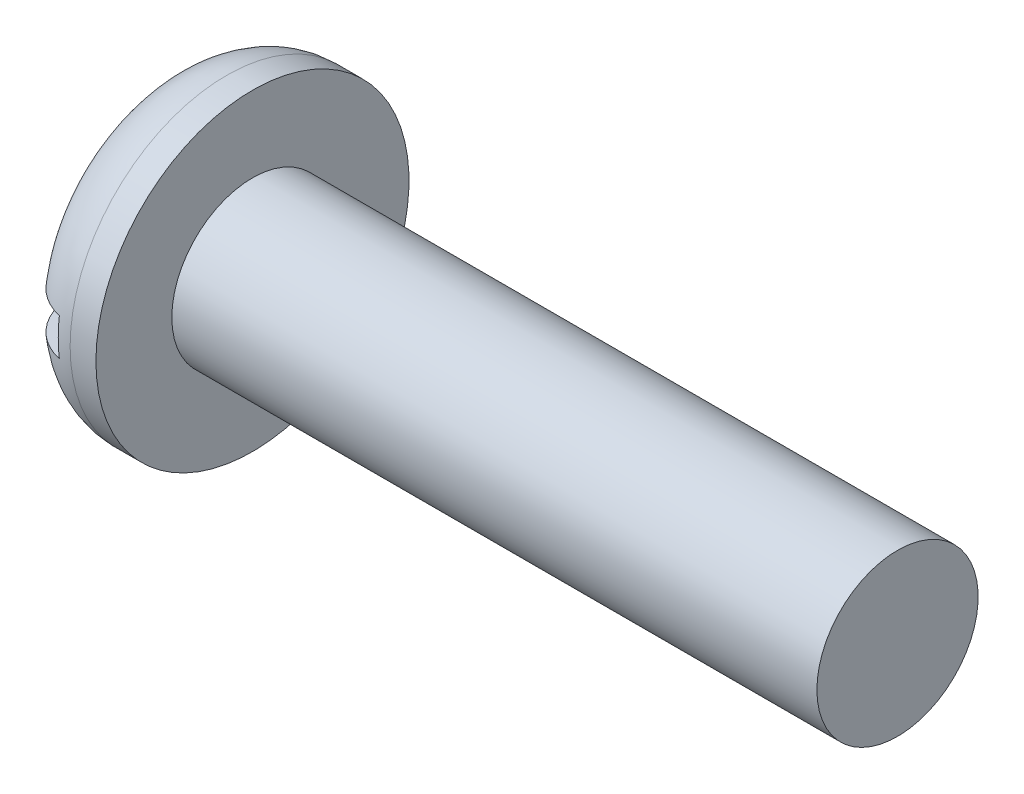
ISO-10303-21;
HEADER;
FILE_DESCRIPTION(('STEP AP214'),'2;1');
FILE_NAME('part.step','',(''),(''),'','','');
FILE_SCHEMA(('AUTOMOTIVE_DESIGN { 1 0 10303 214 1 1 1 1 }'));
ENDSEC;
DATA;
#1=APPLICATION_CONTEXT('core data for automotive mechanical design processes');
#2=APPLICATION_PROTOCOL_DEFINITION('international standard','automotive_design',2000,#1);
#3=PRODUCT_CONTEXT('',#1,'mechanical');
#4=PRODUCT('Part','Part','',(#3));
#5=PRODUCT_RELATED_PRODUCT_CATEGORY('part','',(#4));
#6=PRODUCT_DEFINITION_FORMATION('','',#4);
#7=PRODUCT_DEFINITION_CONTEXT('part definition',#1,'design');
#8=PRODUCT_DEFINITION('design','',#6,#7);
#9=PRODUCT_DEFINITION_SHAPE('','',#8);
#10=(LENGTH_UNIT() NAMED_UNIT(*) SI_UNIT(.MILLI.,.METRE.));
#11=(NAMED_UNIT(*) PLANE_ANGLE_UNIT() SI_UNIT($,.RADIAN.));
#12=(NAMED_UNIT(*) SI_UNIT($,.STERADIAN.) SOLID_ANGLE_UNIT());
#13=UNCERTAINTY_MEASURE_WITH_UNIT(LENGTH_MEASURE(1.E-05),#10,'distance_accuracy_value','');
#14=(GEOMETRIC_REPRESENTATION_CONTEXT(3) GLOBAL_UNCERTAINTY_ASSIGNED_CONTEXT((#13)) GLOBAL_UNIT_ASSIGNED_CONTEXT((#10,
#11,#12)) REPRESENTATION_CONTEXT('',''));
#15=CARTESIAN_POINT('',(0.,0.,0.));
#16=DIRECTION('',(0.,0.,1.));
#17=DIRECTION('',(1.,0.,0.));
#18=AXIS2_PLACEMENT_3D('',#15,#16,#17);
#19=CARTESIAN_POINT('',(0.,0.,0.));
#20=DIRECTION('',(-1.,0.,0.));
#21=DIRECTION('',(0.,0.,1.));
#22=AXIS2_PLACEMENT_3D('',#19,#20,#21);
#23=PLANE('',#22);
#24=DIRECTION('',(0.,0.,-1.));
#25=VECTOR('',#24,1.);
#26=CARTESIAN_POINT('',(0.,1.1049,9.2456));
#27=LINE('',#26,#25);
#28=CARTESIAN_POINT('',(0.,1.1049,5.50358569934184));
#29=VERTEX_POINT('',#28);
#30=CARTESIAN_POINT('',(0.,1.1049,-5.50358569934184));
#31=VERTEX_POINT('',#30);
#32=EDGE_CURVE('E85',#29,#31,#27,.T.);
#33=ORIENTED_EDGE('',*,*,#32,.F.);
#34=CARTESIAN_POINT('',(0.,0.,0.));
#35=DIRECTION('',(-1.,0.,0.));
#36=DIRECTION('',(0.,0.,1.));
#37=AXIS2_PLACEMENT_3D('',#34,#35,#36);
#38=CIRCLE('',#37,5.61339999999997);
#39=EDGE_CURVE('E92',#29,#31,#38,.T.);
#40=ORIENTED_EDGE('',*,*,#39,.T.);
#41=EDGE_LOOP('',(#33,#40));
#42=FACE_BOUND('',#41,.T.);
#43=ADVANCED_FACE('F32',(#42),#23,.T.);
#44=CARTESIAN_POINT('',(-25.4,0.,0.));
#45=DIRECTION('',(-1.,0.,0.));
#46=DIRECTION('',(0.,0.,1.));
#47=AXIS2_PLACEMENT_3D('',#44,#45,#46);
#48=CYLINDRICAL_SURFACE('',#47,4.7625);
#49=CARTESIAN_POINT('',(43.2562,0.,0.));
#50=DIRECTION('',(-1.,0.,0.));
#51=DIRECTION('',(0.,0.,1.));
#52=AXIS2_PLACEMENT_3D('',#49,#50,#51);
#53=CIRCLE('',#52,4.7625);
#54=CARTESIAN_POINT('',(43.2562,0.,4.7625));
#55=VERTEX_POINT('',#54);
#56=EDGE_CURVE('E96',#55,#55,#53,.T.);
#57=ORIENTED_EDGE('',*,*,#56,.T.);
#58=EDGE_LOOP('',(#57));
#59=FACE_BOUND('',#58,.T.);
#60=CARTESIAN_POINT('',(5.1562,0.,0.));
#61=DIRECTION('',(-1.,0.,0.));
#62=DIRECTION('',(0.,0.,1.));
#63=AXIS2_PLACEMENT_3D('',#60,#61,#62);
#64=CIRCLE('',#63,4.7625);
#65=CARTESIAN_POINT('',(5.1562,0.,4.7625));
#66=VERTEX_POINT('',#65);
#67=EDGE_CURVE('E159',#66,#66,#64,.T.);
#68=ORIENTED_EDGE('',*,*,#67,.F.);
#69=EDGE_LOOP('',(#68));
#70=FACE_BOUND('',#69,.T.);
#71=ADVANCED_FACE('F34',(#59,#70),#48,.T.);
#72=CARTESIAN_POINT('',(43.2562,4.7625,0.));
#73=DIRECTION('',(1.,0.,0.));
#74=DIRECTION('',(0.,0.,-1.));
#75=AXIS2_PLACEMENT_3D('',#72,#73,#74);
#76=PLANE('',#75);
#77=ORIENTED_EDGE('',*,*,#56,.F.);
#78=EDGE_LOOP('',(#77));
#79=FACE_BOUND('',#78,.T.);
#80=ADVANCED_FACE('F145',(#79),#76,.T.);
#81=DIRECTION('',(0.,0.,1.));
#82=VECTOR('',#81,1.);
#83=CARTESIAN_POINT('',(0.,-1.1049,-9.2456));
#84=LINE('',#83,#82);
#85=CARTESIAN_POINT('',(0.,-1.1049,-5.50358569934184));
#86=VERTEX_POINT('',#85);
#87=CARTESIAN_POINT('',(0.,-1.1049,5.50358569934184));
#88=VERTEX_POINT('',#87);
#89=EDGE_CURVE('E76',#86,#88,#84,.T.);
#90=ORIENTED_EDGE('',*,*,#89,.F.);
#91=EDGE_CURVE('E83',#86,#88,#38,.T.);
#92=ORIENTED_EDGE('',*,*,#91,.T.);
#93=EDGE_LOOP('',(#90,#92));
#94=FACE_BOUND('',#93,.T.);
#95=ADVANCED_FACE('F82',(#94),#23,.T.);
#96=CARTESIAN_POINT('',(3.6322,0.,0.));
#97=DIRECTION('',(-1.,0.,0.));
#98=DIRECTION('',(0.,0.,1.));
#99=AXIS2_PLACEMENT_3D('',#96,#97,#98);
#100=TOROIDAL_SURFACE('',#99,5.6134,3.6322);
#101=CARTESIAN_POINT('',(1.63607552620524,1.1049,-8.57705458466052));
#102=CARTESIAN_POINT('',(1.80526582947215,1.1049,-8.68926175520025));
#103=CARTESIAN_POINT('',(1.98396739841599,1.1049,-8.78725504147634));
#104=CARTESIAN_POINT('',(2.3553557194657,1.1049,-8.95190398428891));
#105=CARTESIAN_POINT('',(2.54805035400558,1.1049,-9.0185418174154));
#106=CARTESIAN_POINT('',(2.94188428774246,1.1049,-9.11847781019814));
#107=CARTESIAN_POINT('',(3.14302251764104,1.1049,-9.15178017827184));
#108=CARTESIAN_POINT('',(3.54801035915273,1.1049,-9.18407676460486));
#109=CARTESIAN_POINT('',(3.75185965697099,1.1049,-9.18307491947623));
#110=CARTESIAN_POINT('',(4.15616800672068,1.1049,-9.14683312767999));
#111=CARTESIAN_POINT('',(4.3566318717212,1.1049,-9.11164684831084));
#112=CARTESIAN_POINT('',(4.74881439313731,1.1049,-9.00813904376177));
#113=CARTESIAN_POINT('',(4.94053295079168,1.1049,-8.93981714448078));
#114=CARTESIAN_POINT('',(5.30993606050095,1.1049,-8.77196616021689));
#115=CARTESIAN_POINT('',(5.4876111114311,1.1049,-8.67241617035549));
#116=CARTESIAN_POINT('',(5.82380755419607,1.1049,-8.44500778717915));
#117=CARTESIAN_POINT('',(5.9823287471921,1.1049,-8.3171491000268));
#118=CARTESIAN_POINT('',(6.27640711545309,1.1049,-8.0362598290991));
#119=CARTESIAN_POINT('',(6.41187319166582,1.1049,-7.88313389082095));
#120=CARTESIAN_POINT('',(6.6554063345752,1.1049,-7.55646535150447));
#121=CARTESIAN_POINT('',(6.76347271484454,1.1049,-7.38292223912696));
#122=CARTESIAN_POINT('',(6.95010924023208,1.1049,-7.01891475284266));
#123=CARTESIAN_POINT('',(7.02844025973777,1.1049,-6.82832782228801));
#124=CARTESIAN_POINT('',(7.15245956850298,1.1049,-6.43682674863001));
#125=CARTESIAN_POINT('',(7.19814648216069,1.1049,-6.23591217070856));
#126=CARTESIAN_POINT('',(7.25634122992153,1.1049,-5.82655837499554));
#127=CARTESIAN_POINT('',(7.26839014288575,1.1049,-5.61805402911513));
#128=CARTESIAN_POINT('',(7.2580922211906,1.1049,-5.2019075604449));
#129=CARTESIAN_POINT('',(7.23574166645598,1.1049,-4.99426553334417));
#130=CARTESIAN_POINT('',(7.15687981147255,1.1049,-4.58085244426608));
#131=CARTESIAN_POINT('',(7.09962865133076,1.1049,-4.37522275747002));
#132=CARTESIAN_POINT('',(6.95249019505237,1.1049,-3.97603617389343));
#133=CARTESIAN_POINT('',(6.86260203372425,1.1049,-3.78247959732477));
#134=CARTESIAN_POINT('',(6.64974865469934,1.1049,-3.40631444906582));
#135=CARTESIAN_POINT('',(6.52582230216231,1.1049,-3.22424991161817));
#136=CARTESIAN_POINT('',(6.24994692199157,1.1049,-2.88255327563743));
#137=CARTESIAN_POINT('',(6.09797544754672,1.1049,-2.72293932776982));
#138=CARTESIAN_POINT('',(5.76501682479717,1.1049,-2.42613946279573));
#139=CARTESIAN_POINT('',(5.58328741009613,1.1049,-2.2897839002572));
#140=CARTESIAN_POINT('',(5.1987736005942,1.1049,-2.05099614435309));
#141=CARTESIAN_POINT('',(4.99600969000625,1.1049,-1.94853134674756));
#142=CARTESIAN_POINT('',(4.61900755941218,1.1049,-1.80192684852623));
#143=CARTESIAN_POINT('',(4.44781689454045,1.1049,-1.75003208804407));
#144=CARTESIAN_POINT('',(4.18654832161312,1.1049,-1.69423880953675));
#145=CARTESIAN_POINT('',(4.09874661661604,1.1049,-1.67931737818856));
#146=CARTESIAN_POINT('',(3.92215864858265,1.1049,-1.65714370227323));
#147=CARTESIAN_POINT('',(3.83337238747698,1.1049,-1.64989144267015));
#148=CARTESIAN_POINT('',(3.6552720192099,1.1049,-1.64325973654207));
#149=CARTESIAN_POINT('',(3.56595713672393,1.1049,-1.64390120860612));
#150=CARTESIAN_POINT('',(3.38773639371044,1.1049,-1.65308580786615));
#151=CARTESIAN_POINT('',(3.29883053899392,1.1049,-1.66162904697524));
#152=CARTESIAN_POINT('',(3.12203181751936,1.1049,-1.68639293248769));
#153=CARTESIAN_POINT('',(3.03413972818094,1.1049,-1.70261911549147));
#154=CARTESIAN_POINT('',(2.86000419507131,1.1049,-1.74235181115014));
#155=CARTESIAN_POINT('',(2.77376146757311,1.1049,-1.76586141384681));
#156=CARTESIAN_POINT('',(2.52224872597355,1.1049,-1.84535099661262));
#157=CARTESIAN_POINT('',(2.35993271046742,1.1049,-1.91093219812351));
#158=CARTESIAN_POINT('',(2.04639331335189,1.1049,-2.06442145007362));
#159=CARTESIAN_POINT('',(1.89517346779009,1.1049,-2.1523365782452));
#160=CARTESIAN_POINT('',(1.58142490865956,1.1049,-2.36405881456845));
#161=CARTESIAN_POINT('',(1.42128173105454,1.1049,-2.49141723482328));
#162=CARTESIAN_POINT('',(1.12209189054852,1.1049,-2.76889598853386));
#163=CARTESIAN_POINT('',(0.983054255223602,1.1049,-2.91902600761331));
#164=CARTESIAN_POINT('',(0.716298250935731,1.1049,-3.25494550782524));
#165=CARTESIAN_POINT('',(0.591176360740131,1.1049,-3.44280971135979));
#166=CARTESIAN_POINT('',(0.374455671664554,1.1049,-3.83700356537789));
#167=CARTESIAN_POINT('',(0.282858891865907,1.1049,-4.04333432709625));
#168=CARTESIAN_POINT('',(0.136971348381388,1.1049,-4.46746256115801));
#169=CARTESIAN_POINT('',(0.0824628154243494,1.1049,-4.68518487034638));
#170=CARTESIAN_POINT('',(0.0122210365053366,1.1049,-5.12680374394541));
#171=CARTESIAN_POINT('',(-0.00351945795708721,1.1049,-5.35069914624915));
#172=CARTESIAN_POINT('',(0.00469493758024544,1.1049,-5.78995108534169));
#173=CARTESIAN_POINT('',(0.0272859139035312,1.1049,-6.00533334025144));
#174=CARTESIAN_POINT('',(0.109357692883616,1.1049,-6.42898648365661));
#175=CARTESIAN_POINT('',(0.168837323965388,1.1049,-6.63725759777857));
#176=CARTESIAN_POINT('',(0.321112396291099,1.1049,-7.03477289176005));
#177=CARTESIAN_POINT('',(0.412964404853938,1.1049,-7.22437908526981));
#178=CARTESIAN_POINT('',(0.627700935499384,1.1049,-7.58500928440223));
#179=CARTESIAN_POINT('',(0.750562610712627,1.1049,-7.75604683866205));
#180=CARTESIAN_POINT('',(0.995985187701468,1.1049,-8.04205335867176));
#181=CARTESIAN_POINT('',(1.11354304952049,1.1049,-8.16135566721044));
#182=CARTESIAN_POINT('',(1.3639440147817,1.1049,-8.38266766202691));
#183=CARTESIAN_POINT('',(1.49678654333569,1.1049,-8.48467799833515));
#184=CARTESIAN_POINT('',(1.63607552620524,1.1049,-8.57705458466052));
#185=B_SPLINE_CURVE_WITH_KNOTS('',3,(#101,#102,#103,#104,#105,#106,#107,#108,#109,#110,#111,
#112,#113,#114,#115,#116,#117,#118,#119,#120,#121,#122,#123,#124,#125,#126,#127,#128,#129,#130,
#131,#132,#133,#134,#135,#136,#137,#138,#139,#140,#141,#142,#143,#144,#145,#146,#147,#148,#149,
#150,#151,#152,#153,#154,#155,#156,#157,#158,#159,#160,#161,#162,#163,#164,#165,#166,#167,#168,
#169,#170,#171,#172,#173,#174,#175,#176,#177,#178,#179,#180,#181,#182,#183,#184),.UNSPECIFIED.,
.T.,.F.,(4,2,2,2,2,2,2,2,2,2,2,2,2,2,2,2,2,2,2,2,2,2,2,2,2,2,2,2,2,2,2,2,2,2,2,2,2,2,2,2,2,4),
(0.,0.608452943307454,1.21725133352019,1.82597285661784,2.43462452554239,3.04232219318664,
3.65002672189578,4.25813893476456,4.86625745998668,5.47672573728295,6.08720930674562,
6.70250319249297,7.31782300480343,7.94149749834646,8.56523944290631,9.2026875641241,
9.84015258502524,10.4978932562857,11.1561626727591,11.8344646506378,12.5121121645119,
13.0463112049976,13.3132038157634,13.5800959032662,13.8476954135406,14.1152987138973,
14.3830951528194,14.6510053622033,15.1740473602049,15.6972553200395,16.3085922590165,
16.920189955718,17.5940991691686,18.26804896276,18.9380065957889,19.6078389566305,
20.2543337906037,20.900808093104,21.5298179414036,22.1583657025566,22.6593044484141,
23.1602243590758),.UNSPECIFIED.);
#186=CARTESIAN_POINT('',(2.8448,1.1049,-9.09233780310538));
#187=VERTEX_POINT('',#186);
#188=EDGE_CURVE('E11',#31,#187,#185,.T.);
#189=ORIENTED_EDGE('',*,*,#188,.F.);
#190=ORIENTED_EDGE('',*,*,#39,.F.);
#191=CARTESIAN_POINT('',(1.64675908200885,1.1049,2.32243714232349));
#192=CARTESIAN_POINT('',(1.732607034845,1.1049,2.26037977064294));
#193=CARTESIAN_POINT('',(1.82093790493943,1.1049,2.20180710286631));
#194=CARTESIAN_POINT('',(2.00214295816892,1.1049,2.0921771373514));
#195=CARTESIAN_POINT('',(2.09501819336065,1.1049,2.04112159095932));
#196=CARTESIAN_POINT('',(2.37967545267108,1.1049,1.90036256693643));
#197=CARTESIAN_POINT('',(2.57783737423084,1.1049,1.82281187081222));
#198=CARTESIAN_POINT('',(2.86489106500356,1.1049,1.74118401660528));
#199=CARTESIAN_POINT('',(2.94939764250297,1.1049,1.72073473389813));
#200=CARTESIAN_POINT('',(3.11980226521055,1.1049,1.68686373215875));
#201=CARTESIAN_POINT('',(3.2056996021446,1.1049,1.67343854523467));
#202=CARTESIAN_POINT('',(3.37824560186554,1.1049,1.65395231416427));
#203=CARTESIAN_POINT('',(3.46489352741725,1.1049,1.64788472237736));
#204=CARTESIAN_POINT('',(3.63839363246745,1.1049,1.64324900458976));
#205=CARTESIAN_POINT('',(3.72524581560366,1.1049,1.64468101317958));
#206=CARTESIAN_POINT('',(3.89845655178344,1.1049,1.65500640900255));
#207=CARTESIAN_POINT('',(3.98481535827014,1.1049,1.66389553725655));
#208=CARTESIAN_POINT('',(4.15649235814055,1.1049,1.68889366259131));
#209=CARTESIAN_POINT('',(4.24181014046105,1.1049,1.70500542253839));
#210=CARTESIAN_POINT('',(4.49548303356791,1.1049,1.76367524378516));
#211=CARTESIAN_POINT('',(4.66153293941571,1.1049,1.81656621328732));
#212=CARTESIAN_POINT('',(4.98999854283185,1.1049,1.9486824127894));
#213=CARTESIAN_POINT('',(5.15203257254242,1.1049,2.02883716065308));
#214=CARTESIAN_POINT('',(5.46312260363605,1.1049,2.21121021231043));
#215=CARTESIAN_POINT('',(5.61217550672694,1.1049,2.31343376326912));
#216=CARTESIAN_POINT('',(5.91965991023796,1.1049,2.55656949933845));
#217=CARTESIAN_POINT('',(6.07522865991137,1.1049,2.70111723923496));
#218=CARTESIAN_POINT('',(6.36186843651087,1.1049,3.01279576825314));
#219=CARTESIAN_POINT('',(6.49292966201383,1.1049,3.17993554688369));
#220=CARTESIAN_POINT('',(6.73501943977844,1.1049,3.54487010984502));
#221=CARTESIAN_POINT('',(6.84408271928057,1.1049,3.74397595607901));
#222=CARTESIAN_POINT('',(7.02644512097479,1.1049,4.15796624044765));
#223=CARTESIAN_POINT('',(7.09974582695965,1.1049,4.37284997935251));
#224=CARTESIAN_POINT('',(7.20658482558276,1.1049,4.80771718253719));
#225=CARTESIAN_POINT('',(7.2408946733314,1.1049,5.02751060075785));
#226=CARTESIAN_POINT('',(7.27071268909261,1.1049,5.46972279536606));
#227=CARTESIAN_POINT('',(7.26622765362702,1.1049,5.69214110507769));
#228=CARTESIAN_POINT('',(7.21890822642781,1.1049,6.12514189962761));
#229=CARTESIAN_POINT('',(7.17739276278612,1.1049,6.33586883316919));
#230=CARTESIAN_POINT('',(7.05867649425639,1.1049,6.74702277500716));
#231=CARTESIAN_POINT('',(6.98148084363645,1.1049,6.94745126634478));
#232=CARTESIAN_POINT('',(6.79575077802736,1.1049,7.32716585394919));
#233=CARTESIAN_POINT('',(6.68802560131437,1.1049,7.5068480483884));
#234=CARTESIAN_POINT('',(6.44350901084115,1.1049,7.8452106686995));
#235=CARTESIAN_POINT('',(6.30672017396345,1.1049,8.00389295447151));
#236=CARTESIAN_POINT('',(6.0102008283462,1.1049,8.29330702125582));
#237=CARTESIAN_POINT('',(5.85084102147717,1.1049,8.42441874776866));
#238=CARTESIAN_POINT('',(5.51221346273741,1.1049,8.65775229613205));
#239=CARTESIAN_POINT('',(5.33294673259739,1.1049,8.75997559973856));
#240=CARTESIAN_POINT('',(4.96125064259359,1.1049,8.9317616884912));
#241=CARTESIAN_POINT('',(4.76894624596429,1.1049,9.00159494819859));
#242=CARTESIAN_POINT('',(4.37531534672142,1.1049,9.10783086245798));
#243=CARTESIAN_POINT('',(4.17398909549548,1.1049,9.14423444789753));
#244=CARTESIAN_POINT('',(3.76894274189379,1.1049,9.18246092631841));
#245=CARTESIAN_POINT('',(3.56523637269986,1.1049,9.18442948509087));
#246=CARTESIAN_POINT('',(3.16039199804023,1.1049,9.15410266210819));
#247=CARTESIAN_POINT('',(2.95925396455102,1.1049,9.1218076545319));
#248=CARTESIAN_POINT('',(2.56545031736958,1.1049,9.02394334783548));
#249=CARTESIAN_POINT('',(2.37277677533305,1.1049,8.95840594013525));
#250=CARTESIAN_POINT('',(2.00113622011585,1.1049,8.7959785909663));
#251=CARTESIAN_POINT('',(1.82216923896432,1.1049,8.69908857623638));
#252=CARTESIAN_POINT('',(1.48259920815577,1.1049,8.47652736011547));
#253=CARTESIAN_POINT('',(1.32203509959224,1.1049,8.35079675784305));
#254=CARTESIAN_POINT('',(1.02415409710242,1.1049,8.07429881863559));
#255=CARTESIAN_POINT('',(0.886837600840421,1.1049,7.9235310535123));
#256=CARTESIAN_POINT('',(0.638490738266049,1.1049,7.60037859433408));
#257=CARTESIAN_POINT('',(0.5276103843432,1.1049,7.42787864588072));
#258=CARTESIAN_POINT('',(0.336055700766601,1.1049,7.06686137937329));
#259=CARTESIAN_POINT('',(0.255382483722873,1.1049,6.87834347164846));
#260=CARTESIAN_POINT('',(0.125575128707772,1.1049,6.48860746781841));
#261=CARTESIAN_POINT('',(0.0767719687106477,1.1049,6.28727920690702));
#262=CARTESIAN_POINT('',(0.0130576545846982,1.1049,5.87934816684621));
#263=CARTESIAN_POINT('',(-0.0018522561352992,1.1049,5.67274519446971));
#264=CARTESIAN_POINT('',(0.00225438158385445,1.1049,5.25637792534354));
#265=CARTESIAN_POINT('',(0.0218513902908321,1.1049,5.04661952725286));
#266=CARTESIAN_POINT('',(0.095058172201113,1.1049,4.63311250947645));
#267=CARTESIAN_POINT('',(0.148675914684361,1.1049,4.42936530960606));
#268=CARTESIAN_POINT('',(0.289815486564781,1.1049,4.02783878568996));
#269=CARTESIAN_POINT('',(0.378208120676587,1.1049,3.83036611336493));
#270=CARTESIAN_POINT('',(0.585782204669345,1.1049,3.45243478287361));
#271=CARTESIAN_POINT('',(0.704951831820313,1.1049,3.27196962766298));
#272=CARTESIAN_POINT('',(0.953444702948334,1.1049,2.95425588090092));
#273=CARTESIAN_POINT('',(1.07950365918965,1.1049,2.81443321679181));
#274=CARTESIAN_POINT('',(1.35001627093359,1.1049,2.55355668399117));
#275=CARTESIAN_POINT('',(1.49448157158344,1.1049,2.43251480580714));
#276=CARTESIAN_POINT('',(1.64675908200885,1.1049,2.32243714232349));
#277=B_SPLINE_CURVE_WITH_KNOTS('',3,(#191,#192,#193,#194,#195,#196,#197,#198,#199,#200,#201,
#202,#203,#204,#205,#206,#207,#208,#209,#210,#211,#212,#213,#214,#215,#216,#217,#218,#219,#220,
#221,#222,#223,#224,#225,#226,#227,#228,#229,#230,#231,#232,#233,#234,#235,#236,#237,#238,#239,
#240,#241,#242,#243,#244,#245,#246,#247,#248,#249,#250,#251,#252,#253,#254,#255,#256,#257,#258,
#259,#260,#261,#262,#263,#264,#265,#266,#267,#268,#269,#270,#271,#272,#273,#274,#275,#276),
.UNSPECIFIED.,.T.,.F.,(4,2,2,2,2,2,2,2,2,2,2,2,2,2,2,2,2,2,2,2,2,2,2,2,2,2,2,2,2,2,2,2,2,2,2,2,
2,2,2,2,2,2,4),(0.,0.317619745187987,0.63531337303141,1.26942079554807,1.53004517960522,
1.79054076813901,2.05080436698585,2.31107263663216,2.57119236057684,2.8314116728894,
3.35192380285931,3.89233653547655,4.43287790053031,5.06724287925326,5.70186102280723,
6.37958329603863,7.05727555271953,7.72131039163505,8.38522889985189,9.02640473994205,
9.66748798635282,10.2929541282467,10.9183648373189,11.5344916012995,12.1505867569336,
12.7614402066085,13.3722766458538,13.9805285192947,14.5887737503259,15.1964365559415,
15.8041007814848,16.4130279892749,17.0219656120764,17.6342805324783,18.2466180038662,
18.8652176675037,19.4838400247419,20.1129682094238,20.7422438203944,21.3883979217285,
22.034304176497,22.5973416011306,23.1607370282935),.UNSPECIFIED.);
#278=CARTESIAN_POINT('',(2.8448,1.1049,9.09233780310538));
#279=VERTEX_POINT('',#278);
#280=EDGE_CURVE('E110',#279,#29,#277,.T.);
#281=ORIENTED_EDGE('',*,*,#280,.F.);
#282=CARTESIAN_POINT('',(2.8448,0.,0.));
#283=DIRECTION('',(-1.,0.,0.));
#284=DIRECTION('',(0.,0.,1.));
#285=AXIS2_PLACEMENT_3D('',#282,#283,#284);
#286=CIRCLE('',#285,9.1592254440962);
#287=CARTESIAN_POINT('',(2.8448,-1.1049,9.09233780310538));
#288=VERTEX_POINT('',#287);
#289=EDGE_CURVE('E104',#279,#288,#286,.F.);
#290=ORIENTED_EDGE('',*,*,#289,.T.);
#291=CARTESIAN_POINT('',(1.64675908200885,-1.1049,2.32243714232349));
#292=CARTESIAN_POINT('',(1.46458177240409,-1.1049,2.45413225108599));
#293=CARTESIAN_POINT('',(1.2936493883401,-1.1049,2.60144509113291));
#294=CARTESIAN_POINT('',(0.978318142801394,-1.1049,2.92272515959839));
#295=CARTESIAN_POINT('',(0.833978056216416,-1.1049,3.09674990841192));
#296=CARTESIAN_POINT('',(0.57620629962487,-1.1049,3.46692084074664));
#297=CARTESIAN_POINT('',(0.462836647962218,-1.1049,3.66311031524258));
#298=CARTESIAN_POINT('',(0.271318028041957,-1.1049,4.07186406046821));
#299=CARTESIAN_POINT('',(0.193144287368613,-1.1049,4.28441669031915));
#300=CARTESIAN_POINT('',(0.075855581316157,-1.1049,4.71654704497754));
#301=CARTESIAN_POINT('',(0.0361572625729497,-1.1049,4.93596603067291));
#302=CARTESIAN_POINT('',(-0.00441457438826195,-1.1049,5.3784083747287));
#303=CARTESIAN_POINT('',(-0.00528894952491667,-1.1049,5.60143165342679));
#304=CARTESIAN_POINT('',(0.0317084168897638,-1.1049,6.03646043711134));
#305=CARTESIAN_POINT('',(0.0682405892832519,-1.1049,6.24858016248711));
#306=CARTESIAN_POINT('',(0.177332970753203,-1.1049,6.66334159781111));
#307=CARTESIAN_POINT('',(0.249886898956337,-1.1049,6.86598495335312));
#308=CARTESIAN_POINT('',(0.426864739060143,-1.1049,7.25067061330825));
#309=CARTESIAN_POINT('',(0.530442485351557,-1.1049,7.43310248921708));
#310=CARTESIAN_POINT('',(0.767210428178734,-1.1049,7.77761866456346));
#311=CARTESIAN_POINT('',(0.900397972306187,-1.1049,7.93970478451459));
#312=CARTESIAN_POINT('',(1.19033808240142,-1.1049,8.23633535788851));
#313=CARTESIAN_POINT('',(1.34669639555323,-1.1049,8.37126532085471));
#314=CARTESIAN_POINT('',(1.68001819486232,-1.1049,8.61267733974684));
#315=CARTESIAN_POINT('',(1.85698059446486,-1.1049,8.71916089481695));
#316=CARTESIAN_POINT('',(2.22478185559388,-1.1049,8.89971011174255));
#317=CARTESIAN_POINT('',(2.41548380445512,-1.1049,8.97405477312488));
#318=CARTESIAN_POINT('',(2.80669542414545,-1.1049,9.08951002689302));
#319=CARTESIAN_POINT('',(3.00720480406936,-1.1049,9.13062160439573));
#320=CARTESIAN_POINT('',(3.41137470746899,-1.1049,9.17829538043222));
#321=CARTESIAN_POINT('',(3.61501707206391,-1.1049,9.18501165562192));
#322=CARTESIAN_POINT('',(4.02053136531758,-1.1049,9.16411592498274));
#323=CARTESIAN_POINT('',(4.22240331490374,-1.1049,9.13650432548313));
#324=CARTESIAN_POINT('',(4.6184048438621,-1.1049,9.04781135060164));
#325=CARTESIAN_POINT('',(4.81254319036767,-1.1049,8.98676910301983));
#326=CARTESIAN_POINT('',(5.1878423793478,-1.1049,8.83301615719358));
#327=CARTESIAN_POINT('',(5.36900320194401,-1.1049,8.74030541044211));
#328=CARTESIAN_POINT('',(5.71358971961538,-1.1049,8.52569897869186));
#329=CARTESIAN_POINT('',(5.87698174607424,-1.1049,8.40374924501731));
#330=CARTESIAN_POINT('',(6.18110330716266,-1.1049,8.13428111912834));
#331=CARTESIAN_POINT('',(6.3218324763688,-1.1049,7.98676231470938));
#332=CARTESIAN_POINT('',(6.57747096678437,-1.1049,7.66954513573531));
#333=CARTESIAN_POINT('',(6.69224004096505,-1.1049,7.49973376946912));
#334=CARTESIAN_POINT('',(6.8919523303713,-1.1049,7.14340481412864));
#335=CARTESIAN_POINT('',(6.97689457401665,-1.1049,6.95688668109588));
#336=CARTESIAN_POINT('',(7.11550854344899,-1.1049,6.57050412551787));
#337=CARTESIAN_POINT('',(7.16886437542947,-1.1049,6.37052644481069));
#338=CARTESIAN_POINT('',(7.24182570243168,-1.1049,5.96452068852361));
#339=CARTESIAN_POINT('',(7.26142937031563,-1.1049,5.75849228600826));
#340=CARTESIAN_POINT('',(7.26678738559332,-1.1049,5.34261264339648));
#341=CARTESIAN_POINT('',(7.25197911177651,-1.1049,5.13275431188416));
#342=CARTESIAN_POINT('',(7.18824709573132,-1.1049,4.71829488331707));
#343=CARTESIAN_POINT('',(7.13931889278175,-1.1049,4.51369447729204));
#344=CARTESIAN_POINT('',(7.00750465260621,-1.1049,4.10987139530049));
#345=CARTESIAN_POINT('',(6.92377093914148,-1.1049,3.91092575402535));
#346=CARTESIAN_POINT('',(6.72518920361683,-1.1049,3.52925794303483));
#347=CARTESIAN_POINT('',(6.61034005022946,-1.1049,3.34653636353153));
#348=CARTESIAN_POINT('',(6.34857865604724,-1.1049,2.99588882793277));
#349=CARTESIAN_POINT('',(6.20070493332052,-1.1049,2.82868176263355));
#350=CARTESIAN_POINT('',(5.87913806094973,-1.1049,2.52062648075667));
#351=CARTESIAN_POINT('',(5.70541484043453,-1.1049,2.37980940072583));
#352=CARTESIAN_POINT('',(5.4275105935424,-1.1049,2.19137596173563));
#353=CARTESIAN_POINT('',(5.33114203306372,-1.1049,2.13198045266207));
#354=CARTESIAN_POINT('',(5.13340772136558,-1.1049,2.02207886038696));
#355=CARTESIAN_POINT('',(5.03204167360905,-1.1049,1.9715733055053));
#356=CARTESIAN_POINT('',(4.82516615620044,-1.1049,1.88045271146499));
#357=CARTESIAN_POINT('',(4.71966449799638,-1.1049,1.83981997948266));
#358=CARTESIAN_POINT('',(4.50512922399073,-1.1049,1.76932399033706));
#359=CARTESIAN_POINT('',(4.39609678566213,-1.1049,1.739457182366));
#360=CARTESIAN_POINT('',(4.1873156350969,-1.1049,1.69402927991816));
#361=CARTESIAN_POINT('',(4.08782618817093,-1.1049,1.67727699891563));
#362=CARTESIAN_POINT('',(3.8876804380883,-1.1049,1.65365384853728));
#363=CARTESIAN_POINT('',(3.78702427225128,-1.1049,1.6467818279505));
#364=CARTESIAN_POINT('',(3.58556133681135,-1.1049,1.64316996335826));
#365=CARTESIAN_POINT('',(3.48475463560607,-1.1049,1.64642642124047));
#366=CARTESIAN_POINT('',(3.2839933148104,-1.1049,1.6629304612879));
#367=CARTESIAN_POINT('',(3.18403866335827,-1.1049,1.67617766818459));
#368=CARTESIAN_POINT('',(2.91582156339703,-1.1049,1.72499860269171));
#369=CARTESIAN_POINT('',(2.7491650648261,-1.1049,1.76973247883931));
#370=CARTESIAN_POINT('',(2.4247365587373,-1.1049,1.88363184415779));
#371=CARTESIAN_POINT('',(2.26696004088659,-1.1049,1.95278479811725));
#372=CARTESIAN_POINT('',(1.95201279810902,-1.1049,2.1176284136928));
#373=CARTESIAN_POINT('',(1.79563132445722,-1.1049,2.21481810785927));
#374=CARTESIAN_POINT('',(1.64675908200885,-1.1049,2.32243714232349));
#375=B_SPLINE_CURVE_WITH_KNOTS('',3,(#291,#292,#293,#294,#295,#296,#297,#298,#299,#300,#301,
#302,#303,#304,#305,#306,#307,#308,#309,#310,#311,#312,#313,#314,#315,#316,#317,#318,#319,#320,
#321,#322,#323,#324,#325,#326,#327,#328,#329,#330,#331,#332,#333,#334,#335,#336,#337,#338,#339,
#340,#341,#342,#343,#344,#345,#346,#347,#348,#349,#350,#351,#352,#353,#354,#355,#356,#357,#358,
#359,#360,#361,#362,#363,#364,#365,#366,#367,#368,#369,#370,#371,#372,#373,#374),.UNSPECIFIED.,
.T.,.F.,(4,2,2,2,2,2,2,2,2,2,2,2,2,2,2,2,2,2,2,2,2,2,2,2,2,2,2,2,2,2,2,2,2,2,2,2,2,2,2,2,2,4),
(0.,0.673685393669611,1.34884237192005,2.02534160425412,2.70136393971767,3.3669683761353,
4.03255812138336,4.67511845650142,5.31756679198614,5.94388027958598,6.57013768540438,
7.18675605300442,7.80334191800245,8.41446208744854,9.02556414100467,9.63392630186077,
10.242281261776,10.8499257096589,11.4575710882825,12.0663484873521,12.6751357015676,
13.2871371991772,13.8991586302962,14.5172017452768,15.1352783163172,15.7635311179623,
16.391866070602,17.0364946925005,17.6811467556217,18.3478261226762,19.0152871944091,
19.354521469284,19.6937758976659,20.0324177973874,20.3709479041125,20.6731516429266,
20.9753201672379,21.2773783766632,21.5794252408637,22.0947597269385,22.6098300565063,
23.1603544630742),.UNSPECIFIED.);
#376=EDGE_CURVE('E91',#88,#288,#375,.T.);
#377=ORIENTED_EDGE('',*,*,#376,.F.);
#378=ORIENTED_EDGE('',*,*,#91,.F.);
#379=CARTESIAN_POINT('',(1.63607552620524,-1.1049,-8.57705458466052));
#380=CARTESIAN_POINT('',(1.46545008415866,-1.1049,-8.46387716320867));
#381=CARTESIAN_POINT('',(1.30429767994663,-1.1049,-8.33610472745136));
#382=CARTESIAN_POINT('',(1.00565958988531,-1.1049,-8.05512890884101));
#383=CARTESIAN_POINT('',(0.868207522780488,-1.1049,-7.90188999691795));
#384=CARTESIAN_POINT('',(0.621053102972034,-1.1049,-7.5746747417305));
#385=CARTESIAN_POINT('',(0.511325111778218,-1.1049,-7.40071777868912));
#386=CARTESIAN_POINT('',(0.322417900178562,-1.1049,-7.03702486275886));
#387=CARTESIAN_POINT('',(0.243230057894061,-1.1049,-6.84729338163406));
#388=CARTESIAN_POINT('',(0.116805936561227,-1.1049,-6.45581748565659));
#389=CARTESIAN_POINT('',(0.0698272799037613,-1.1049,-6.25398993839246));
#390=CARTESIAN_POINT('',(0.00980744262746897,-1.1049,-5.84535467187867));
#391=CARTESIAN_POINT('',(-0.00323012251472791,-1.1049,-5.63854642444224));
#392=CARTESIAN_POINT('',(0.00465073538929193,-1.1049,-5.22201899254232));
#393=CARTESIAN_POINT('',(0.0261588007330884,-1.1049,-5.01231113549658));
#394=CARTESIAN_POINT('',(0.103139863911565,-1.1049,-4.59924016350525));
#395=CARTESIAN_POINT('',(0.158616925751644,-1.1049,-4.39587781078731));
#396=CARTESIAN_POINT('',(0.303436224517882,-1.1049,-3.99539519175576));
#397=CARTESIAN_POINT('',(0.393650232165023,-1.1049,-3.79859051657006));
#398=CARTESIAN_POINT('',(0.604753980823551,-1.1049,-3.42220825376695));
#399=CARTESIAN_POINT('',(0.725646344852298,-1.1049,-3.24263214101182));
#400=CARTESIAN_POINT('',(0.999167226663177,-1.1049,-2.89931253963451));
#401=CARTESIAN_POINT('',(1.15274359852077,-1.1049,-2.73632522140979));
#402=CARTESIAN_POINT('',(1.48509895908941,-1.1049,-2.43776003569265));
#403=CARTESIAN_POINT('',(1.66390710646891,-1.1049,-2.3022143281962));
#404=CARTESIAN_POINT('',(1.94836737898893,-1.1049,-2.12306872278833));
#405=CARTESIAN_POINT('',(2.04643864030662,-1.1049,-2.06715985936983));
#406=CARTESIAN_POINT('',(2.24732194965384,-1.1049,-1.96450874166398));
#407=CARTESIAN_POINT('',(2.35013423666798,-1.1049,-1.91776695009365));
#408=CARTESIAN_POINT('',(2.5595686892455,-1.1049,-1.83449462013656));
#409=CARTESIAN_POINT('',(2.66618216102948,-1.1049,-1.79794227938168));
#410=CARTESIAN_POINT('',(2.88258671237064,-1.1049,-1.7359148247261));
#411=CARTESIAN_POINT('',(2.99237695148743,-1.1049,-1.71043680908751));
#412=CARTESIAN_POINT('',(3.20047955867526,-1.1049,-1.67384248599121));
#413=CARTESIAN_POINT('',(3.2985503526356,-1.1049,-1.66134916003489));
#414=CARTESIAN_POINT('',(3.49544122276126,-1.1049,-1.64598471981599));
#415=CARTESIAN_POINT('',(3.59426121501894,-1.1049,-1.6431125435184));
#416=CARTESIAN_POINT('',(3.79168227981389,-1.1049,-1.64709371437036));
#417=CARTESIAN_POINT('',(3.89028340131741,-1.1049,-1.65394460661764));
#418=CARTESIAN_POINT('',(4.0863372429237,-1.1049,-1.67711784187158));
#419=CARTESIAN_POINT('',(4.18378997024973,-1.1049,-1.69344012527183));
#420=CARTESIAN_POINT('',(4.44799884008723,-1.1049,-1.75045489985809));
#421=CARTESIAN_POINT('',(4.61285476065707,-1.1049,-1.8002426523332));
#422=CARTESIAN_POINT('',(4.93334676791809,-1.1049,-1.92350375218094));
#423=CARTESIAN_POINT('',(5.08897711597392,-1.1049,-1.99699166261931));
#424=CARTESIAN_POINT('',(5.40838980202868,-1.1049,-2.17537758037917));
#425=CARTESIAN_POINT('',(5.57058233950683,-1.1049,-2.28312429625205));
#426=CARTESIAN_POINT('',(5.87749106693814,-1.1049,-2.52110133105258));
#427=CARTESIAN_POINT('',(6.02220167833256,-1.1049,-2.65133879483583));
#428=CARTESIAN_POINT('',(6.3102617199677,-1.1049,-2.95087743572408));
#429=CARTESIAN_POINT('',(6.45059846212745,-1.1049,-3.12309398140196));
#430=CARTESIAN_POINT('',(6.70101179457539,-1.1049,-3.4883296230993));
#431=CARTESIAN_POINT('',(6.81108132594674,-1.1049,-3.68135355723005));
#432=CARTESIAN_POINT('',(6.99899955370288,-1.1049,-4.0867594099478));
#433=CARTESIAN_POINT('',(7.07623850125647,-1.1049,-4.29942520683545));
#434=CARTESIAN_POINT('',(7.19256742869932,-1.1049,-4.73495779374543));
#435=CARTESIAN_POINT('',(7.23166328542755,-1.1049,-4.95782300676687));
#436=CARTESIAN_POINT('',(7.26922563247678,-1.1049,-5.39963781953868));
#437=CARTESIAN_POINT('',(7.26897484267519,-1.1049,-5.6184782851574));
#438=CARTESIAN_POINT('',(7.23052100956693,-1.1049,-6.05280579264262));
#439=CARTESIAN_POINT('',(7.19232428513953,-1.1049,-6.26829338677204));
#440=CARTESIAN_POINT('',(7.08048773094802,-1.1049,-6.68280216055346));
#441=CARTESIAN_POINT('',(7.00796536225104,-1.1049,-6.88212518874627));
#442=CARTESIAN_POINT('',(6.82982377614166,-1.1049,-7.26539120594957));
#443=CARTESIAN_POINT('',(6.72420845857081,-1.1049,-7.44933600397492));
#444=CARTESIAN_POINT('',(6.48521309277273,-1.1049,-7.79282392325747));
#445=CARTESIAN_POINT('',(6.35242117603836,-1.1049,-7.95277646607168));
#446=CARTESIAN_POINT('',(6.06158087000792,-1.1049,-8.2477852921481));
#447=CARTESIAN_POINT('',(5.90353416334271,-1.1049,-8.38284323275313));
#448=CARTESIAN_POINT('',(5.56868924289916,-1.1049,-8.6226127162577));
#449=CARTESIAN_POINT('',(5.39213125313705,-1.1049,-8.72765985033747));
#450=CARTESIAN_POINT('',(5.02380720357459,-1.1049,-8.90639444932365));
#451=CARTESIAN_POINT('',(4.8320424414925,-1.1049,-8.98008458676972));
#452=CARTESIAN_POINT('',(4.44009616690326,-1.1049,-9.09356370321434));
#453=CARTESIAN_POINT('',(4.23997787309909,-1.1049,-9.1335711567185));
#454=CARTESIAN_POINT('',(3.83580042201142,-1.1049,-9.17932886342123));
#455=CARTESIAN_POINT('',(3.63174024273739,-1.1049,-9.18507010970111));
#456=CARTESIAN_POINT('',(3.22603053944339,-1.1049,-9.16214158790693));
#457=CARTESIAN_POINT('',(3.0243767537536,-1.1049,-9.13354627199025));
#458=CARTESIAN_POINT('',(2.62892934460947,-1.1049,-9.04291218292845));
#459=CARTESIAN_POINT('',(2.43512541172526,-1.1049,-8.98091891179509));
#460=CARTESIAN_POINT('',(2.14109416332311,-1.1049,-8.85880953674688));
#461=CARTESIAN_POINT('',(2.03635096550244,-1.1049,-8.80926961511377));
#462=CARTESIAN_POINT('',(1.83208718708456,-1.1049,-8.70039382698383));
#463=CARTESIAN_POINT('',(1.73256658948399,-1.1049,-8.64105799238241));
#464=CARTESIAN_POINT('',(1.63607552620524,-1.1049,-8.57705458466052));
#465=B_SPLINE_CURVE_WITH_KNOTS('',3,(#379,#380,#381,#382,#383,#384,#385,#386,#387,#388,#389,
#390,#391,#392,#393,#394,#395,#396,#397,#398,#399,#400,#401,#402,#403,#404,#405,#406,#407,#408,
#409,#410,#411,#412,#413,#414,#415,#416,#417,#418,#419,#420,#421,#422,#423,#424,#425,#426,#427,
#428,#429,#430,#431,#432,#433,#434,#435,#436,#437,#438,#439,#440,#441,#442,#443,#444,#445,#446,
#447,#448,#449,#450,#451,#452,#453,#454,#455,#456,#457,#458,#459,#460,#461,#462,#463,#464),
.UNSPECIFIED.,.T.,.F.,(4,2,2,2,2,2,2,2,2,2,2,2,2,2,2,2,2,2,2,2,2,2,2,2,2,2,2,2,2,2,2,2,2,2,2,2,
2,2,2,2,2,2,4),(0.,0.613818098452112,1.22849985542181,1.8426110731051,2.4565487921243,
3.07534148072404,3.69420008172905,4.32373438951162,4.95334402865859,5.59990935926236,
6.24652999021582,6.91537199802193,7.5849933698402,7.92327709251254,8.26157788599829,
8.59914916177429,8.93663193240826,9.23277145431418,9.5288782856458,9.82491036855558,
10.1209405884639,10.635318318236,11.1500127224806,11.7319256325296,12.3140237457561,
12.9774179219308,13.6409666838835,14.3163512795196,14.9916317998558,15.6449025721963,
16.2980645780152,16.9312893409786,17.5644395095602,18.1851130888235,18.8057453321897,
19.4191384005494,20.0324791792773,20.641810333571,21.2513016443278,21.8594737746882,
22.4668194074469,22.8139432191814,23.1610659007051),.UNSPECIFIED.);
#466=CARTESIAN_POINT('',(2.8448,-1.1049,-9.09233780310538));
#467=VERTEX_POINT('',#466);
#468=EDGE_CURVE('E44',#467,#86,#465,.T.);
#469=ORIENTED_EDGE('',*,*,#468,.F.);
#470=EDGE_CURVE('E56',#467,#187,#286,.F.);
#471=ORIENTED_EDGE('',*,*,#470,.T.);
#472=EDGE_LOOP('',(#189,#190,#281,#290,#377,#378,#469,#471));
#473=FACE_BOUND('',#472,.T.);
#474=CARTESIAN_POINT('',(3.63220000000003,0.,0.));
#475=DIRECTION('',(-1.,0.,0.));
#476=DIRECTION('',(0.,0.,1.));
#477=AXIS2_PLACEMENT_3D('',#474,#475,#476);
#478=CIRCLE('',#477,9.2456);
#479=CARTESIAN_POINT('',(3.63220000000003,0.,9.2456));
#480=VERTEX_POINT('',#479);
#481=EDGE_CURVE('E93',#480,#480,#478,.T.);
#482=ORIENTED_EDGE('',*,*,#481,.T.);
#483=EDGE_LOOP('',(#482));
#484=FACE_BOUND('',#483,.T.);
#485=ADVANCED_FACE('F88',(#473,#484),#100,.T.);
#486=CARTESIAN_POINT('',(-25.4,0.,0.));
#487=DIRECTION('',(-1.,0.,0.));
#488=DIRECTION('',(0.,0.,1.));
#489=AXIS2_PLACEMENT_3D('',#486,#487,#488);
#490=CYLINDRICAL_SURFACE('',#489,9.2456);
#491=CARTESIAN_POINT('',(5.1562,0.,0.));
#492=DIRECTION('',(-1.,0.,0.));
#493=DIRECTION('',(0.,0.,1.));
#494=AXIS2_PLACEMENT_3D('',#491,#492,#493);
#495=CIRCLE('',#494,9.2456);
#496=CARTESIAN_POINT('',(5.1562,0.,9.2456));
#497=VERTEX_POINT('',#496);
#498=EDGE_CURVE('E98',#497,#497,#495,.T.);
#499=ORIENTED_EDGE('',*,*,#498,.T.);
#500=EDGE_LOOP('',(#499));
#501=FACE_BOUND('',#500,.T.);
#502=ORIENTED_EDGE('',*,*,#481,.F.);
#503=EDGE_LOOP('',(#502));
#504=FACE_BOUND('',#503,.T.);
#505=ADVANCED_FACE('F131',(#501,#504),#490,.T.);
#506=CARTESIAN_POINT('',(5.1562,4.7625,0.));
#507=DIRECTION('',(-1.,0.,0.));
#508=DIRECTION('',(0.,0.,1.));
#509=AXIS2_PLACEMENT_3D('',#506,#507,#508);
#510=PLANE('',#509);
#511=ORIENTED_EDGE('',*,*,#498,.F.);
#512=EDGE_LOOP('',(#511));
#513=FACE_BOUND('',#512,.T.);
#514=ORIENTED_EDGE('',*,*,#67,.T.);
#515=EDGE_LOOP('',(#514));
#516=FACE_BOUND('',#515,.T.);
#517=ADVANCED_FACE('F127',(#513,#516),#510,.F.);
#518=CARTESIAN_POINT('',(2.8448,1.1049,9.2456));
#519=DIRECTION('',(0.,1.,0.));
#520=DIRECTION('',(0.,0.,1.));
#521=AXIS2_PLACEMENT_3D('',#518,#519,#520);
#522=PLANE('',#521);
#523=ORIENTED_EDGE('',*,*,#188,.T.);
#524=DIRECTION('',(0.,0.,-1.));
#525=VECTOR('',#524,1.);
#526=CARTESIAN_POINT('',(2.8448,1.1049,9.2456));
#527=LINE('',#526,#525);
#528=EDGE_CURVE('E84',#279,#187,#527,.T.);
#529=ORIENTED_EDGE('',*,*,#528,.F.);
#530=ORIENTED_EDGE('',*,*,#280,.T.);
#531=ORIENTED_EDGE('',*,*,#32,.T.);
#532=EDGE_LOOP('',(#523,#529,#530,#531));
#533=FACE_BOUND('',#532,.T.);
#534=ADVANCED_FACE('F120',(#533),#522,.F.);
#535=CARTESIAN_POINT('',(2.8448,-1.1049,-9.2456));
#536=DIRECTION('',(0.,-1.,0.));
#537=DIRECTION('',(0.,0.,-1.));
#538=AXIS2_PLACEMENT_3D('',#535,#536,#537);
#539=PLANE('',#538);
#540=ORIENTED_EDGE('',*,*,#468,.T.);
#541=ORIENTED_EDGE('',*,*,#89,.T.);
#542=ORIENTED_EDGE('',*,*,#376,.T.);
#543=DIRECTION('',(0.,0.,1.));
#544=VECTOR('',#543,1.);
#545=CARTESIAN_POINT('',(2.8448,-1.1049,-9.2456));
#546=LINE('',#545,#544);
#547=EDGE_CURVE('E51',#467,#288,#546,.T.);
#548=ORIENTED_EDGE('',*,*,#547,.F.);
#549=EDGE_LOOP('',(#540,#541,#542,#548));
#550=FACE_BOUND('',#549,.T.);
#551=ADVANCED_FACE('F75',(#550),#539,.F.);
#552=CARTESIAN_POINT('',(2.8448,1.1049,-9.2456));
#553=DIRECTION('',(-1.,0.,0.));
#554=DIRECTION('',(0.,0.,1.));
#555=AXIS2_PLACEMENT_3D('',#552,#553,#554);
#556=PLANE('',#555);
#557=ORIENTED_EDGE('',*,*,#547,.T.);
#558=ORIENTED_EDGE('',*,*,#289,.F.);
#559=ORIENTED_EDGE('',*,*,#528,.T.);
#560=ORIENTED_EDGE('',*,*,#470,.F.);
#561=EDGE_LOOP('',(#557,#558,#559,#560));
#562=FACE_BOUND('',#561,.T.);
#563=ADVANCED_FACE('F119',(#562),#556,.T.);
#564=CLOSED_SHELL('',(#43,#71,#80,#95,#485,#505,#517,#534,#551,#563));
#565=MANIFOLD_SOLID_BREP('B2',#564);
#566=ADVANCED_BREP_SHAPE_REPRESENTATION('',(#18,#565),#14);
#567=SHAPE_DEFINITION_REPRESENTATION(#9,#566);
ENDSEC;
END-ISO-10303-21;
